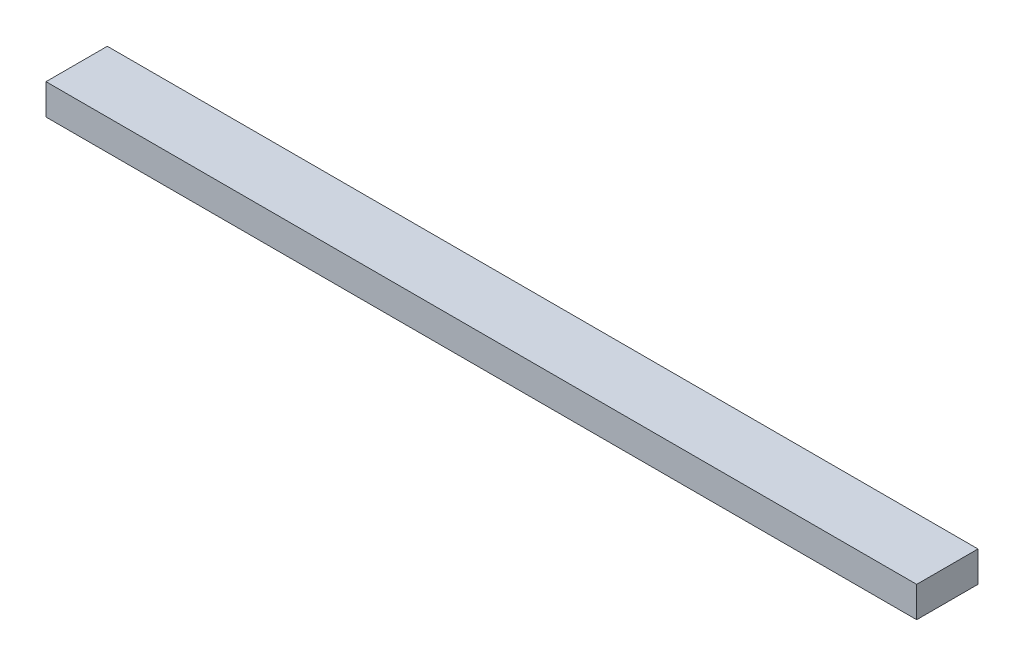
ISO-10303-21;
HEADER;
FILE_DESCRIPTION(('STEP AP214'),'2;1');
FILE_NAME('part.step','',(''),(''),'','','');
FILE_SCHEMA(('AUTOMOTIVE_DESIGN { 1 0 10303 214 1 1 1 1 }'));
ENDSEC;
DATA;
#1=APPLICATION_CONTEXT('core data for automotive mechanical design processes');
#2=APPLICATION_PROTOCOL_DEFINITION('international standard','automotive_design',2000,#1);
#3=PRODUCT_CONTEXT('',#1,'mechanical');
#4=PRODUCT('Part','Part','',(#3));
#5=PRODUCT_RELATED_PRODUCT_CATEGORY('part','',(#4));
#6=PRODUCT_DEFINITION_FORMATION('','',#4);
#7=PRODUCT_DEFINITION_CONTEXT('part definition',#1,'design');
#8=PRODUCT_DEFINITION('design','',#6,#7);
#9=PRODUCT_DEFINITION_SHAPE('','',#8);
#10=(LENGTH_UNIT() NAMED_UNIT(*) SI_UNIT(.MILLI.,.METRE.));
#11=(NAMED_UNIT(*) PLANE_ANGLE_UNIT() SI_UNIT($,.RADIAN.));
#12=(NAMED_UNIT(*) SI_UNIT($,.STERADIAN.) SOLID_ANGLE_UNIT());
#13=UNCERTAINTY_MEASURE_WITH_UNIT(LENGTH_MEASURE(1.E-05),#10,'distance_accuracy_value','');
#14=(GEOMETRIC_REPRESENTATION_CONTEXT(3) GLOBAL_UNCERTAINTY_ASSIGNED_CONTEXT((#13)) GLOBAL_UNIT_ASSIGNED_CONTEXT((#10,
#11,#12)) REPRESENTATION_CONTEXT('',''));
#15=CARTESIAN_POINT('',(0.,0.,0.));
#16=DIRECTION('',(0.,0.,1.));
#17=DIRECTION('',(1.,0.,0.));
#18=AXIS2_PLACEMENT_3D('',#15,#16,#17);
#19=CARTESIAN_POINT('',(0.,2.5,0.));
#20=DIRECTION('',(1.,0.,0.));
#21=DIRECTION('',(0.,0.,-1.));
#22=AXIS2_PLACEMENT_3D('',#19,#20,#21);
#23=PLANE('',#22);
#24=DIRECTION('',(0.,0.,1.));
#25=VECTOR('',#24,1.);
#26=CARTESIAN_POINT('',(0.,0.,0.));
#27=LINE('',#26,#25);
#28=CARTESIAN_POINT('',(0.,0.,-5.));
#29=VERTEX_POINT('',#28);
#30=CARTESIAN_POINT('',(0.,0.,0.));
#31=VERTEX_POINT('',#30);
#32=EDGE_CURVE('E107',#29,#31,#27,.T.);
#33=ORIENTED_EDGE('',*,*,#32,.T.);
#34=DIRECTION('',(0.,-1.,0.));
#35=VECTOR('',#34,1.);
#36=CARTESIAN_POINT('',(0.,2.5,0.));
#37=LINE('',#36,#35);
#38=CARTESIAN_POINT('',(0.,2.5,0.));
#39=VERTEX_POINT('',#38);
#40=EDGE_CURVE('E11',#39,#31,#37,.T.);
#41=ORIENTED_EDGE('',*,*,#40,.F.);
#42=DIRECTION('',(0.,0.,1.));
#43=VECTOR('',#42,1.);
#44=CARTESIAN_POINT('',(0.,2.5,0.));
#45=LINE('',#44,#43);
#46=CARTESIAN_POINT('',(0.,2.5,-5.));
#47=VERTEX_POINT('',#46);
#48=EDGE_CURVE('E91',#47,#39,#45,.T.);
#49=ORIENTED_EDGE('',*,*,#48,.F.);
#50=DIRECTION('',(0.,-1.,0.));
#51=VECTOR('',#50,1.);
#52=CARTESIAN_POINT('',(0.,2.5,-5.));
#53=LINE('',#52,#51);
#54=EDGE_CURVE('E103',#47,#29,#53,.T.);
#55=ORIENTED_EDGE('',*,*,#54,.T.);
#56=EDGE_LOOP('',(#33,#41,#49,#55));
#57=FACE_BOUND('',#56,.T.);
#58=ADVANCED_FACE('F39',(#57),#23,.F.);
#59=CARTESIAN_POINT('',(0.,2.5,0.));
#60=DIRECTION('',(0.,0.,-1.));
#61=DIRECTION('',(-1.,0.,0.));
#62=AXIS2_PLACEMENT_3D('',#59,#60,#61);
#63=PLANE('',#62);
#64=DIRECTION('',(1.,0.,0.));
#65=VECTOR('',#64,1.);
#66=CARTESIAN_POINT('',(0.,0.,0.));
#67=LINE('',#66,#65);
#68=CARTESIAN_POINT('',(71.,0.,0.));
#69=VERTEX_POINT('',#68);
#70=EDGE_CURVE('E96',#31,#69,#67,.T.);
#71=ORIENTED_EDGE('',*,*,#70,.T.);
#72=DIRECTION('',(0.,-1.,0.));
#73=VECTOR('',#72,1.);
#74=CARTESIAN_POINT('',(71.,2.5,0.));
#75=LINE('',#74,#73);
#76=CARTESIAN_POINT('',(71.,2.5,0.));
#77=VERTEX_POINT('',#76);
#78=EDGE_CURVE('E48',#77,#69,#75,.T.);
#79=ORIENTED_EDGE('',*,*,#78,.F.);
#80=DIRECTION('',(1.,0.,0.));
#81=VECTOR('',#80,1.);
#82=CARTESIAN_POINT('',(0.,2.5,0.));
#83=LINE('',#82,#81);
#84=EDGE_CURVE('E86',#39,#77,#83,.T.);
#85=ORIENTED_EDGE('',*,*,#84,.F.);
#86=ORIENTED_EDGE('',*,*,#40,.T.);
#87=EDGE_LOOP('',(#71,#79,#85,#86));
#88=FACE_BOUND('',#87,.T.);
#89=ADVANCED_FACE('F95',(#88),#63,.F.);
#90=CARTESIAN_POINT('',(71.,2.5,0.));
#91=DIRECTION('',(-1.,0.,0.));
#92=DIRECTION('',(0.,0.,1.));
#93=AXIS2_PLACEMENT_3D('',#90,#91,#92);
#94=PLANE('',#93);
#95=DIRECTION('',(0.,0.,-1.));
#96=VECTOR('',#95,1.);
#97=CARTESIAN_POINT('',(71.,0.,0.));
#98=LINE('',#97,#96);
#99=CARTESIAN_POINT('',(71.,0.,-5.));
#100=VERTEX_POINT('',#99);
#101=EDGE_CURVE('E73',#69,#100,#98,.T.);
#102=ORIENTED_EDGE('',*,*,#101,.T.);
#103=DIRECTION('',(0.,-1.,0.));
#104=VECTOR('',#103,1.);
#105=CARTESIAN_POINT('',(71.,2.5,-5.));
#106=LINE('',#105,#104);
#107=CARTESIAN_POINT('',(71.,2.5,-5.));
#108=VERTEX_POINT('',#107);
#109=EDGE_CURVE('E98',#108,#100,#106,.T.);
#110=ORIENTED_EDGE('',*,*,#109,.F.);
#111=DIRECTION('',(0.,0.,-1.));
#112=VECTOR('',#111,1.);
#113=CARTESIAN_POINT('',(71.,2.5,0.));
#114=LINE('',#113,#112);
#115=EDGE_CURVE('E89',#77,#108,#114,.T.);
#116=ORIENTED_EDGE('',*,*,#115,.F.);
#117=ORIENTED_EDGE('',*,*,#78,.T.);
#118=EDGE_LOOP('',(#102,#110,#116,#117));
#119=FACE_BOUND('',#118,.T.);
#120=ADVANCED_FACE('F99',(#119),#94,.F.);
#121=CARTESIAN_POINT('',(0.,2.5,-5.));
#122=DIRECTION('',(0.,0.,1.));
#123=DIRECTION('',(1.,0.,0.));
#124=AXIS2_PLACEMENT_3D('',#121,#122,#123);
#125=PLANE('',#124);
#126=DIRECTION('',(-1.,0.,0.));
#127=VECTOR('',#126,1.);
#128=CARTESIAN_POINT('',(0.,0.,-5.));
#129=LINE('',#128,#127);
#130=EDGE_CURVE('E79',#100,#29,#129,.T.);
#131=ORIENTED_EDGE('',*,*,#130,.T.);
#132=ORIENTED_EDGE('',*,*,#54,.F.);
#133=DIRECTION('',(-1.,0.,0.));
#134=VECTOR('',#133,1.);
#135=CARTESIAN_POINT('',(0.,2.5,-5.));
#136=LINE('',#135,#134);
#137=EDGE_CURVE('E56',#108,#47,#136,.T.);
#138=ORIENTED_EDGE('',*,*,#137,.F.);
#139=ORIENTED_EDGE('',*,*,#109,.T.);
#140=EDGE_LOOP('',(#131,#132,#138,#139));
#141=FACE_BOUND('',#140,.T.);
#142=ADVANCED_FACE('F120',(#141),#125,.F.);
#143=CARTESIAN_POINT('',(0.,2.5,0.));
#144=DIRECTION('',(0.,-1.,0.));
#145=DIRECTION('',(0.,0.,-1.));
#146=AXIS2_PLACEMENT_3D('',#143,#144,#145);
#147=PLANE('',#146);
#148=ORIENTED_EDGE('',*,*,#48,.T.);
#149=ORIENTED_EDGE('',*,*,#84,.T.);
#150=ORIENTED_EDGE('',*,*,#115,.T.);
#151=ORIENTED_EDGE('',*,*,#137,.T.);
#152=EDGE_LOOP('',(#148,#149,#150,#151));
#153=FACE_BOUND('',#152,.T.);
#154=ADVANCED_FACE('F87',(#153),#147,.F.);
#155=CARTESIAN_POINT('',(0.,0.,0.));
#156=DIRECTION('',(0.,-1.,0.));
#157=DIRECTION('',(0.,0.,-1.));
#158=AXIS2_PLACEMENT_3D('',#155,#156,#157);
#159=PLANE('',#158);
#160=ORIENTED_EDGE('',*,*,#32,.F.);
#161=ORIENTED_EDGE('',*,*,#130,.F.);
#162=ORIENTED_EDGE('',*,*,#101,.F.);
#163=ORIENTED_EDGE('',*,*,#70,.F.);
#164=EDGE_LOOP('',(#160,#161,#162,#163));
#165=FACE_BOUND('',#164,.T.);
#166=ADVANCED_FACE('F123',(#165),#159,.T.);
#167=CLOSED_SHELL('',(#58,#89,#120,#142,#154,#166));
#168=MANIFOLD_SOLID_BREP('B2',#167);
#169=ADVANCED_BREP_SHAPE_REPRESENTATION('',(#18,#168),#14);
#170=SHAPE_DEFINITION_REPRESENTATION(#9,#169);
ENDSEC;
END-ISO-10303-21;
